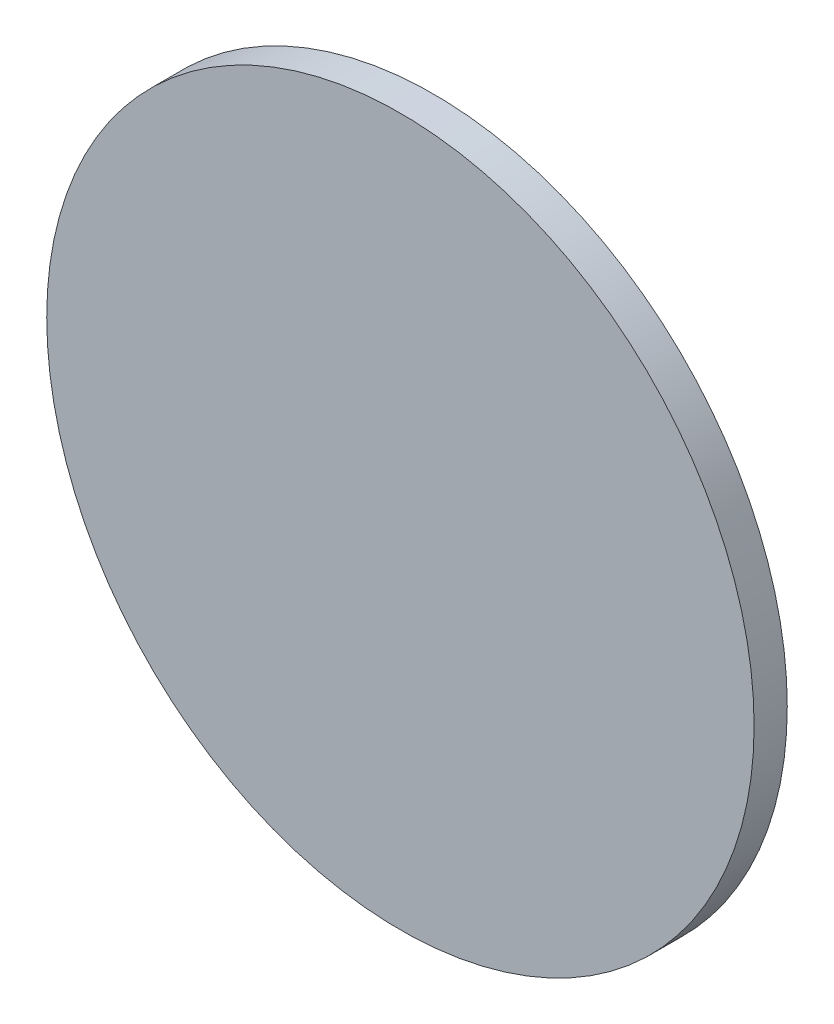
ISO-10303-21;
HEADER;
FILE_DESCRIPTION(('STEP AP214'),'2;1');
FILE_NAME('part.step','',(''),(''),'','','');
FILE_SCHEMA(('AUTOMOTIVE_DESIGN { 1 0 10303 214 1 1 1 1 }'));
ENDSEC;
DATA;
#1=APPLICATION_CONTEXT('core data for automotive mechanical design processes');
#2=APPLICATION_PROTOCOL_DEFINITION('international standard','automotive_design',2000,#1);
#3=PRODUCT_CONTEXT('',#1,'mechanical');
#4=PRODUCT('Part','Part','',(#3));
#5=PRODUCT_RELATED_PRODUCT_CATEGORY('part','',(#4));
#6=PRODUCT_DEFINITION_FORMATION('','',#4);
#7=PRODUCT_DEFINITION_CONTEXT('part definition',#1,'design');
#8=PRODUCT_DEFINITION('design','',#6,#7);
#9=PRODUCT_DEFINITION_SHAPE('','',#8);
#10=(LENGTH_UNIT() NAMED_UNIT(*) SI_UNIT(.MILLI.,.METRE.));
#11=(NAMED_UNIT(*) PLANE_ANGLE_UNIT() SI_UNIT($,.RADIAN.));
#12=(NAMED_UNIT(*) SI_UNIT($,.STERADIAN.) SOLID_ANGLE_UNIT());
#13=UNCERTAINTY_MEASURE_WITH_UNIT(LENGTH_MEASURE(1.E-05),#10,'distance_accuracy_value','');
#14=(GEOMETRIC_REPRESENTATION_CONTEXT(3) GLOBAL_UNCERTAINTY_ASSIGNED_CONTEXT((#13)) GLOBAL_UNIT_ASSIGNED_CONTEXT((#10,
#11,#12)) REPRESENTATION_CONTEXT('',''));
#15=CARTESIAN_POINT('',(0.,0.,0.));
#16=DIRECTION('',(0.,0.,1.));
#17=DIRECTION('',(1.,0.,0.));
#18=AXIS2_PLACEMENT_3D('',#15,#16,#17);
#19=CARTESIAN_POINT('',(0.,0.,1.5));
#20=DIRECTION('',(0.,0.,-1.));
#21=DIRECTION('',(-1.,0.,0.));
#22=AXIS2_PLACEMENT_3D('',#19,#20,#21);
#23=CYLINDRICAL_SURFACE('',#22,16.);
#24=CARTESIAN_POINT('',(0.,0.,1.5));
#25=DIRECTION('',(0.,0.,1.));
#26=DIRECTION('',(1.,0.,0.));
#27=AXIS2_PLACEMENT_3D('',#24,#25,#26);
#28=CIRCLE('',#27,16.);
#29=CARTESIAN_POINT('',(16.,0.,1.5));
#30=VERTEX_POINT('',#29);
#31=EDGE_CURVE('E10',#30,#30,#28,.T.);
#32=ORIENTED_EDGE('',*,*,#31,.F.);
#33=EDGE_LOOP('',(#32));
#34=FACE_BOUND('',#33,.T.);
#35=CARTESIAN_POINT('',(0.,0.,0.));
#36=DIRECTION('',(0.,0.,1.));
#37=DIRECTION('',(1.,0.,0.));
#38=AXIS2_PLACEMENT_3D('',#35,#36,#37);
#39=CIRCLE('',#38,16.);
#40=CARTESIAN_POINT('',(16.,0.,0.));
#41=VERTEX_POINT('',#40);
#42=EDGE_CURVE('E38',#41,#41,#39,.T.);
#43=ORIENTED_EDGE('',*,*,#42,.T.);
#44=EDGE_LOOP('',(#43));
#45=FACE_BOUND('',#44,.T.);
#46=ADVANCED_FACE('F35',(#34,#45),#23,.T.);
#47=CARTESIAN_POINT('',(0.,0.,1.5));
#48=DIRECTION('',(0.,0.,1.));
#49=DIRECTION('',(1.,0.,0.));
#50=AXIS2_PLACEMENT_3D('',#47,#48,#49);
#51=PLANE('',#50);
#52=ORIENTED_EDGE('',*,*,#31,.T.);
#53=EDGE_LOOP('',(#52));
#54=FACE_BOUND('',#53,.T.);
#55=ADVANCED_FACE('F50',(#54),#51,.T.);
#56=CARTESIAN_POINT('',(0.,0.,0.));
#57=DIRECTION('',(0.,0.,1.));
#58=DIRECTION('',(1.,0.,0.));
#59=AXIS2_PLACEMENT_3D('',#56,#57,#58);
#60=PLANE('',#59);
#61=ORIENTED_EDGE('',*,*,#42,.F.);
#62=EDGE_LOOP('',(#61));
#63=FACE_BOUND('',#62,.T.);
#64=ADVANCED_FACE('F48',(#63),#60,.F.);
#65=CLOSED_SHELL('',(#46,#55,#64));
#66=MANIFOLD_SOLID_BREP('B2',#65);
#67=ADVANCED_BREP_SHAPE_REPRESENTATION('',(#18,#66),#14);
#68=SHAPE_DEFINITION_REPRESENTATION(#9,#67);
ENDSEC;
END-ISO-10303-21;
